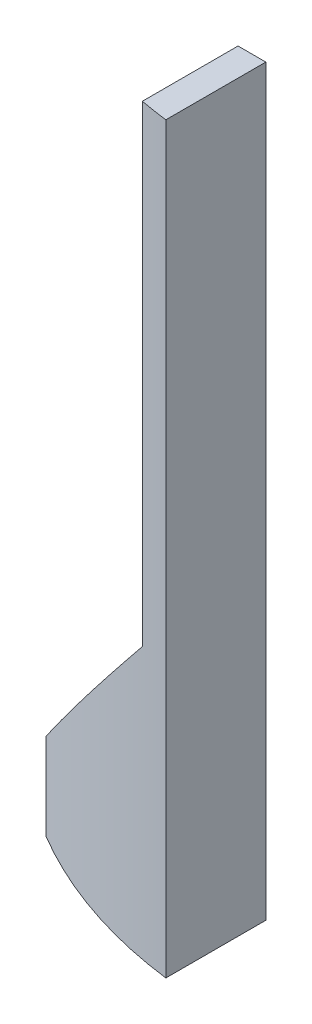
ISO-10303-21;
HEADER;
FILE_DESCRIPTION(('STEP AP214'),'2;1');
FILE_NAME('part.step','',(''),(''),'','','');
FILE_SCHEMA(('AUTOMOTIVE_DESIGN { 1 0 10303 214 1 1 1 1 }'));
ENDSEC;
DATA;
#1=APPLICATION_CONTEXT('core data for automotive mechanical design processes');
#2=APPLICATION_PROTOCOL_DEFINITION('international standard','automotive_design',2000,#1);
#3=PRODUCT_CONTEXT('',#1,'mechanical');
#4=PRODUCT('Part','Part','',(#3));
#5=PRODUCT_RELATED_PRODUCT_CATEGORY('part','',(#4));
#6=PRODUCT_DEFINITION_FORMATION('','',#4);
#7=PRODUCT_DEFINITION_CONTEXT('part definition',#1,'design');
#8=PRODUCT_DEFINITION('design','',#6,#7);
#9=PRODUCT_DEFINITION_SHAPE('','',#8);
#10=(LENGTH_UNIT() NAMED_UNIT(*) SI_UNIT(.MILLI.,.METRE.));
#11=(NAMED_UNIT(*) PLANE_ANGLE_UNIT() SI_UNIT($,.RADIAN.));
#12=(NAMED_UNIT(*) SI_UNIT($,.STERADIAN.) SOLID_ANGLE_UNIT());
#13=UNCERTAINTY_MEASURE_WITH_UNIT(LENGTH_MEASURE(1.E-05),#10,'distance_accuracy_value','');
#14=(GEOMETRIC_REPRESENTATION_CONTEXT(3) GLOBAL_UNCERTAINTY_ASSIGNED_CONTEXT((#13)) GLOBAL_UNIT_ASSIGNED_CONTEXT((#10,
#11,#12)) REPRESENTATION_CONTEXT('',''));
#15=CARTESIAN_POINT('',(0.,0.,0.));
#16=DIRECTION('',(0.,0.,1.));
#17=DIRECTION('',(1.,0.,0.));
#18=AXIS2_PLACEMENT_3D('',#15,#16,#17);
#19=CARTESIAN_POINT('',(430.,1980.,758.5));
#20=DIRECTION('',(0.,-1.,0.));
#21=DIRECTION('',(0.,0.,-1.));
#22=AXIS2_PLACEMENT_3D('',#19,#20,#21);
#23=PLANE('',#22);
#24=DIRECTION('',(1.,0.,0.));
#25=VECTOR('',#24,1.);
#26=CARTESIAN_POINT('',(430.,1980.,766.75));
#27=LINE('',#26,#25);
#28=CARTESIAN_POINT('',(372.,1980.,766.75));
#29=VERTEX_POINT('',#28);
#30=CARTESIAN_POINT('',(430.,1980.,766.75));
#31=VERTEX_POINT('',#30);
#32=EDGE_CURVE('E94',#29,#31,#27,.T.);
#33=ORIENTED_EDGE('',*,*,#32,.F.);
#34=DIRECTION('',(0.,0.,-1.));
#35=VECTOR('',#34,1.);
#36=CARTESIAN_POINT('',(372.,1980.,2905.5));
#37=LINE('',#36,#35);
#38=CARTESIAN_POINT('',(372.,1980.,966.216642660214));
#39=VERTEX_POINT('',#38);
#40=EDGE_CURVE('E78',#39,#29,#37,.T.);
#41=ORIENTED_EDGE('',*,*,#40,.F.);
#42=CARTESIAN_POINT('',(553.096762915364,1980.,-2.4321144556397));
#43=DIRECTION('',(0.,-1.,0.));
#44=DIRECTION('',(1.,0.,0.));
#45=AXIS2_PLACEMENT_3D('',#42,#43,#44);
#46=CIRCLE('',#45,985.432114455639);
#47=CARTESIAN_POINT('',(430.,1980.,975.281360525794));
#48=VERTEX_POINT('',#47);
#49=EDGE_CURVE('E106',#39,#48,#46,.F.);
#50=ORIENTED_EDGE('',*,*,#49,.T.);
#51=DIRECTION('',(0.,0.,1.));
#52=VECTOR('',#51,1.);
#53=CARTESIAN_POINT('',(430.,1980.,758.5));
#54=LINE('',#53,#52);
#55=EDGE_CURVE('E114',#31,#48,#54,.T.);
#56=ORIENTED_EDGE('',*,*,#55,.F.);
#57=EDGE_LOOP('',(#33,#41,#50,#56));
#58=FACE_BOUND('',#57,.T.);
#59=ADVANCED_FACE('F17',(#58),#23,.F.);
#60=CARTESIAN_POINT('',(430.,430.,1431.75));
#61=DIRECTION('',(0.,1.,0.));
#62=DIRECTION('',(0.,0.,1.));
#63=AXIS2_PLACEMENT_3D('',#60,#61,#62);
#64=PLANE('',#63);
#65=DIRECTION('',(-1.,0.,0.));
#66=VECTOR('',#65,1.);
#67=CARTESIAN_POINT('',(430.,430.,766.75));
#68=LINE('',#67,#66);
#69=CARTESIAN_POINT('',(430.,430.,766.75));
#70=VERTEX_POINT('',#69);
#71=CARTESIAN_POINT('',(50.,430.,766.75));
#72=VERTEX_POINT('',#71);
#73=EDGE_CURVE('E39',#70,#72,#68,.T.);
#74=ORIENTED_EDGE('',*,*,#73,.F.);
#75=DIRECTION('',(0.,0.,-1.));
#76=VECTOR('',#75,1.);
#77=CARTESIAN_POINT('',(430.,430.,1431.75));
#78=LINE('',#77,#76);
#79=CARTESIAN_POINT('',(430.,430.,975.281360525794));
#80=VERTEX_POINT('',#79);
#81=EDGE_CURVE('E116',#80,#70,#78,.T.);
#82=ORIENTED_EDGE('',*,*,#81,.F.);
#83=CARTESIAN_POINT('',(553.096762915364,430.,-2.43211445563942));
#84=DIRECTION('',(0.,1.,0.));
#85=DIRECTION('',(-1.,0.,0.));
#86=AXIS2_PLACEMENT_3D('',#83,#84,#85);
#87=CIRCLE('',#86,985.432114455639);
#88=CARTESIAN_POINT('',(50.,430.,844.899048280981));
#89=VERTEX_POINT('',#88);
#90=EDGE_CURVE('E103',#80,#89,#87,.F.);
#91=ORIENTED_EDGE('',*,*,#90,.T.);
#92=DIRECTION('',(0.,0.,-1.));
#93=VECTOR('',#92,1.);
#94=CARTESIAN_POINT('',(50.,430.,1431.75));
#95=LINE('',#94,#93);
#96=EDGE_CURVE('E112',#89,#72,#95,.T.);
#97=ORIENTED_EDGE('',*,*,#96,.T.);
#98=EDGE_LOOP('',(#74,#82,#91,#97));
#99=FACE_BOUND('',#98,.T.);
#100=ADVANCED_FACE('F127',(#99),#64,.F.);
#101=CARTESIAN_POINT('',(430.,1980.,758.5));
#102=DIRECTION('',(1.,0.,0.));
#103=DIRECTION('',(0.,1.,0.));
#104=AXIS2_PLACEMENT_3D('',#101,#102,#103);
#105=PLANE('',#104);
#106=ORIENTED_EDGE('',*,*,#81,.T.);
#107=DIRECTION('',(0.,1.,0.));
#108=VECTOR('',#107,1.);
#109=CARTESIAN_POINT('',(430.,1980.,766.75));
#110=LINE('',#109,#108);
#111=EDGE_CURVE('E31',#70,#31,#110,.T.);
#112=ORIENTED_EDGE('',*,*,#111,.T.);
#113=ORIENTED_EDGE('',*,*,#55,.T.);
#114=DIRECTION('',(0.,1.,0.));
#115=VECTOR('',#114,1.);
#116=CARTESIAN_POINT('',(430.,2.19684482045376E-13,975.281360525794));
#117=LINE('',#116,#115);
#118=EDGE_CURVE('E109',#80,#48,#117,.T.);
#119=ORIENTED_EDGE('',*,*,#118,.F.);
#120=EDGE_LOOP('',(#106,#112,#113,#119));
#121=FACE_BOUND('',#120,.T.);
#122=ADVANCED_FACE('F126',(#121),#105,.T.);
#123=CARTESIAN_POINT('',(50.,1980.,758.5));
#124=DIRECTION('',(1.,0.,0.));
#125=DIRECTION('',(0.,1.,0.));
#126=AXIS2_PLACEMENT_3D('',#123,#124,#125);
#127=PLANE('',#126);
#128=DIRECTION('',(0.,1.,0.));
#129=VECTOR('',#128,1.);
#130=CARTESIAN_POINT('',(50.,1980.,766.75));
#131=LINE('',#130,#129);
#132=CARTESIAN_POINT('',(50.,611.443121296013,766.75));
#133=VERTEX_POINT('',#132);
#134=EDGE_CURVE('E87',#72,#133,#131,.T.);
#135=ORIENTED_EDGE('',*,*,#134,.F.);
#136=ORIENTED_EDGE('',*,*,#96,.F.);
#137=DIRECTION('',(0.,1.,0.));
#138=VECTOR('',#137,1.);
#139=CARTESIAN_POINT('',(50.,3.18217100013542E-13,844.899048280981));
#140=LINE('',#139,#138);
#141=CARTESIAN_POINT('',(50.,611.443121296013,844.899048280981));
#142=VERTEX_POINT('',#141);
#143=EDGE_CURVE('E118',#89,#142,#140,.T.);
#144=ORIENTED_EDGE('',*,*,#143,.T.);
#145=DIRECTION('',(0.,0.,-1.));
#146=VECTOR('',#145,1.);
#147=CARTESIAN_POINT('',(50.,611.443121296013,758.5));
#148=LINE('',#147,#146);
#149=EDGE_CURVE('E24',#142,#133,#148,.T.);
#150=ORIENTED_EDGE('',*,*,#149,.T.);
#151=EDGE_LOOP('',(#135,#136,#144,#150));
#152=FACE_BOUND('',#151,.T.);
#153=ADVANCED_FACE('F120',(#152),#127,.F.);
#154=CARTESIAN_POINT('',(372.,1980.,2905.5));
#155=DIRECTION('',(1.,0.,0.));
#156=DIRECTION('',(0.,-1.,0.));
#157=AXIS2_PLACEMENT_3D('',#154,#155,#156);
#158=PLANE('',#157);
#159=DIRECTION('',(0.,1.,0.));
#160=VECTOR('',#159,1.);
#161=CARTESIAN_POINT('',(372.,1980.,766.75));
#162=LINE('',#161,#160);
#163=CARTESIAN_POINT('',(372.,995.187778111349,766.75));
#164=VERTEX_POINT('',#163);
#165=EDGE_CURVE('E82',#164,#29,#162,.T.);
#166=ORIENTED_EDGE('',*,*,#165,.F.);
#167=DIRECTION('',(0.,0.,-1.));
#168=VECTOR('',#167,1.);
#169=CARTESIAN_POINT('',(372.,995.187778111349,2905.5));
#170=LINE('',#169,#168);
#171=CARTESIAN_POINT('',(372.,995.187778111349,966.216642660214));
#172=VERTEX_POINT('',#171);
#173=EDGE_CURVE('E70',#172,#164,#170,.T.);
#174=ORIENTED_EDGE('',*,*,#173,.F.);
#175=DIRECTION('',(0.,1.,0.));
#176=VECTOR('',#175,1.);
#177=CARTESIAN_POINT('',(372.,2.17007441158216E-13,966.216642660214));
#178=LINE('',#177,#176);
#179=EDGE_CURVE('E101',#39,#172,#178,.F.);
#180=ORIENTED_EDGE('',*,*,#179,.F.);
#181=ORIENTED_EDGE('',*,*,#40,.T.);
#182=EDGE_LOOP('',(#166,#174,#180,#181));
#183=FACE_BOUND('',#182,.T.);
#184=ADVANCED_FACE('F83',(#183),#158,.F.);
#185=CARTESIAN_POINT('',(372.,995.187778111349,2905.5));
#186=DIRECTION('',(0.766044443118978,-0.642787609686539,0.));
#187=DIRECTION('',(-0.642787609686539,-0.766044443118978,0.));
#188=AXIS2_PLACEMENT_3D('',#185,#186,#187);
#189=PLANE('',#188);
#190=DIRECTION('',(0.642787609686539,0.766044443118978,0.));
#191=VECTOR('',#190,1.);
#192=CARTESIAN_POINT('',(372.,995.187778111349,766.75));
#193=LINE('',#192,#191);
#194=EDGE_CURVE('E11',#133,#164,#193,.T.);
#195=ORIENTED_EDGE('',*,*,#194,.F.);
#196=ORIENTED_EDGE('',*,*,#149,.F.);
#197=CARTESIAN_POINT('',(553.096762915364,1211.01049592292,-2.43211445563956));
#198=DIRECTION('',(0.766044443118978,-0.642787609686539,0.));
#199=DIRECTION('',(0.642787609686539,0.766044443118978,0.));
#200=AXIS2_PLACEMENT_3D('',#197,#198,#199);
#201=ELLIPSE('',#200,1533.06022021208,985.432114455639);
#202=EDGE_CURVE('E75',#172,#142,#201,.T.);
#203=ORIENTED_EDGE('',*,*,#202,.F.);
#204=ORIENTED_EDGE('',*,*,#173,.T.);
#205=EDGE_LOOP('',(#195,#196,#203,#204));
#206=FACE_BOUND('',#205,.T.);
#207=ADVANCED_FACE('F72',(#206),#189,.F.);
#208=CARTESIAN_POINT('',(553.096762915364,0.,-2.43211445563934));
#209=DIRECTION('',(0.,1.,0.));
#210=DIRECTION('',(-0.95075370828785,0.,-0.309947392595747));
#211=AXIS2_PLACEMENT_3D('',#208,#209,#210);
#212=CYLINDRICAL_SURFACE('',#211,985.432114455639);
#213=ORIENTED_EDGE('',*,*,#49,.F.);
#214=ORIENTED_EDGE('',*,*,#179,.T.);
#215=ORIENTED_EDGE('',*,*,#202,.T.);
#216=ORIENTED_EDGE('',*,*,#143,.F.);
#217=ORIENTED_EDGE('',*,*,#90,.F.);
#218=ORIENTED_EDGE('',*,*,#118,.T.);
#219=EDGE_LOOP('',(#213,#214,#215,#216,#217,#218));
#220=FACE_BOUND('',#219,.T.);
#221=ADVANCED_FACE('F123',(#220),#212,.T.);
#222=CARTESIAN_POINT('',(372.,1720.,766.75));
#223=DIRECTION('',(0.,0.,-1.));
#224=DIRECTION('',(1.,0.,0.));
#225=AXIS2_PLACEMENT_3D('',#222,#223,#224);
#226=PLANE('',#225);
#227=ORIENTED_EDGE('',*,*,#111,.F.);
#228=ORIENTED_EDGE('',*,*,#73,.T.);
#229=ORIENTED_EDGE('',*,*,#134,.T.);
#230=ORIENTED_EDGE('',*,*,#194,.T.);
#231=ORIENTED_EDGE('',*,*,#165,.T.);
#232=ORIENTED_EDGE('',*,*,#32,.T.);
#233=EDGE_LOOP('',(#227,#228,#229,#230,#231,#232));
#234=FACE_BOUND('',#233,.T.);
#235=ADVANCED_FACE('F90',(#234),#226,.T.);
#236=CLOSED_SHELL('',(#59,#100,#122,#153,#184,#207,#221,#235));
#237=MANIFOLD_SOLID_BREP('B1',#236);
#238=ADVANCED_BREP_SHAPE_REPRESENTATION('',(#18,#237),#14);
#239=SHAPE_DEFINITION_REPRESENTATION(#9,#238);
ENDSEC;
END-ISO-10303-21;
